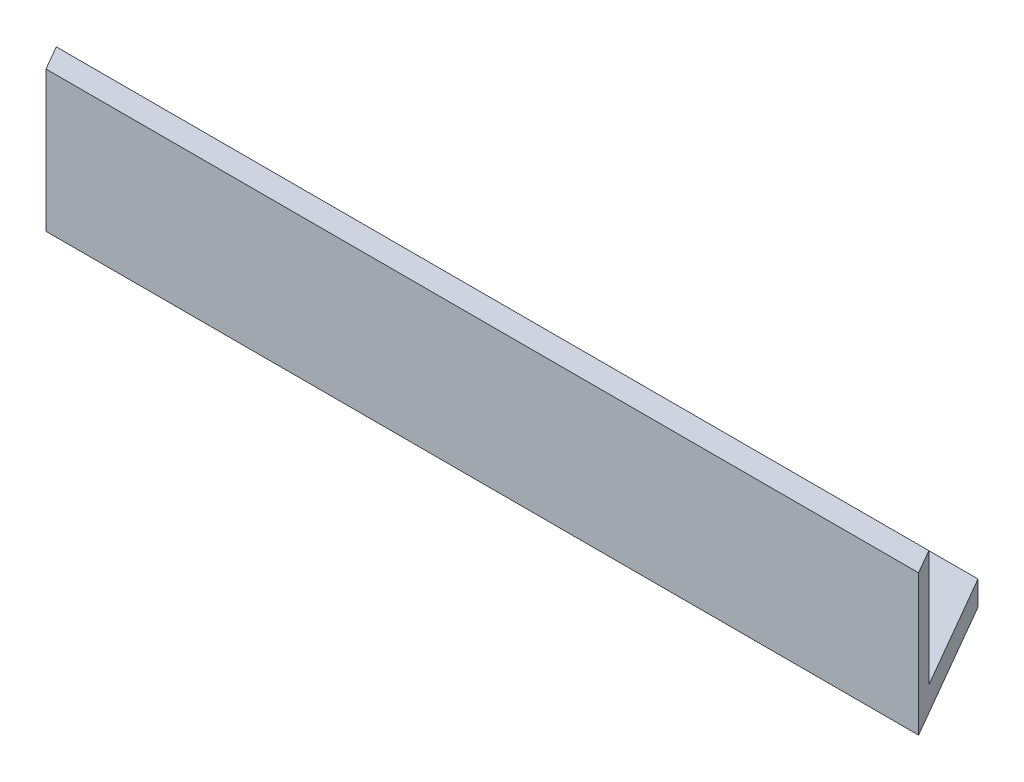
ISO-10303-21;
HEADER;
FILE_DESCRIPTION(('STEP AP214'),'2;1');
FILE_NAME('part.step','',(''),(''),'','','');
FILE_SCHEMA(('AUTOMOTIVE_DESIGN { 1 0 10303 214 1 1 1 1 }'));
ENDSEC;
DATA;
#1=APPLICATION_CONTEXT('core data for automotive mechanical design processes');
#2=APPLICATION_PROTOCOL_DEFINITION('international standard','automotive_design',2000,#1);
#3=PRODUCT_CONTEXT('',#1,'mechanical');
#4=PRODUCT('Part','Part','',(#3));
#5=PRODUCT_RELATED_PRODUCT_CATEGORY('part','',(#4));
#6=PRODUCT_DEFINITION_FORMATION('','',#4);
#7=PRODUCT_DEFINITION_CONTEXT('part definition',#1,'design');
#8=PRODUCT_DEFINITION('design','',#6,#7);
#9=PRODUCT_DEFINITION_SHAPE('','',#8);
#10=(LENGTH_UNIT() NAMED_UNIT(*) SI_UNIT(.MILLI.,.METRE.));
#11=(NAMED_UNIT(*) PLANE_ANGLE_UNIT() SI_UNIT($,.RADIAN.));
#12=(NAMED_UNIT(*) SI_UNIT($,.STERADIAN.) SOLID_ANGLE_UNIT());
#13=UNCERTAINTY_MEASURE_WITH_UNIT(LENGTH_MEASURE(1.E-05),#10,'distance_accuracy_value','');
#14=(GEOMETRIC_REPRESENTATION_CONTEXT(3) GLOBAL_UNCERTAINTY_ASSIGNED_CONTEXT((#13)) GLOBAL_UNIT_ASSIGNED_CONTEXT((#10,
#11,#12)) REPRESENTATION_CONTEXT('',''));
#15=CARTESIAN_POINT('',(0.,0.,0.));
#16=DIRECTION('',(0.,0.,1.));
#17=DIRECTION('',(1.,0.,0.));
#18=AXIS2_PLACEMENT_3D('',#15,#16,#17);
#19=CARTESIAN_POINT('',(240.,20.,0.));
#20=DIRECTION('',(0.,0.,-1.));
#21=DIRECTION('',(0.,1.,0.));
#22=AXIS2_PLACEMENT_3D('',#19,#20,#21);
#23=PLANE('',#22);
#24=DIRECTION('',(-1.,0.,0.));
#25=VECTOR('',#24,1.);
#26=CARTESIAN_POINT('',(240.,20.,0.));
#27=LINE('',#26,#25);
#28=CARTESIAN_POINT('',(135.677313259562,20.,0.));
#29=VERTEX_POINT('',#28);
#30=CARTESIAN_POINT('',(11.5470053837926,20.,0.));
#31=VERTEX_POINT('',#30);
#32=EDGE_CURVE('E102',#29,#31,#27,.T.);
#33=ORIENTED_EDGE('',*,*,#32,.T.);
#34=DIRECTION('',(0.,-1.,0.));
#35=VECTOR('',#34,1.);
#36=CARTESIAN_POINT('',(11.5470053837926,20.,0.));
#37=LINE('',#36,#35);
#38=CARTESIAN_POINT('',(11.5470053837926,0.,0.));
#39=VERTEX_POINT('',#38);
#40=EDGE_CURVE('E86',#31,#39,#37,.T.);
#41=ORIENTED_EDGE('',*,*,#40,.T.);
#42=DIRECTION('',(-1.,0.,0.));
#43=VECTOR('',#42,1.);
#44=CARTESIAN_POINT('',(240.,0.,0.));
#45=LINE('',#44,#43);
#46=CARTESIAN_POINT('',(135.677313259562,0.,0.));
#47=VERTEX_POINT('',#46);
#48=EDGE_CURVE('E11',#47,#39,#45,.T.);
#49=ORIENTED_EDGE('',*,*,#48,.F.);
#50=DIRECTION('',(0.,-1.,0.));
#51=VECTOR('',#50,1.);
#52=CARTESIAN_POINT('',(135.677313259562,20.,0.));
#53=LINE('',#52,#51);
#54=EDGE_CURVE('E107',#29,#47,#53,.T.);
#55=ORIENTED_EDGE('',*,*,#54,.F.);
#56=EDGE_LOOP('',(#33,#41,#49,#55));
#57=FACE_BOUND('',#56,.T.);
#58=ADVANCED_FACE('F36',(#57),#23,.F.);
#59=CARTESIAN_POINT('',(240.,0.,0.));
#60=DIRECTION('',(0.,1.,0.));
#61=DIRECTION('',(0.,0.,1.));
#62=AXIS2_PLACEMENT_3D('',#59,#60,#61);
#63=PLANE('',#62);
#64=ORIENTED_EDGE('',*,*,#48,.T.);
#65=DIRECTION('',(0.500000000000001,0.,0.866025403784438));
#66=VECTOR('',#65,1.);
#67=CARTESIAN_POINT('',(0.,0.,-20.));
#68=LINE('',#67,#66);
#69=CARTESIAN_POINT('',(0.,0.,-20.));
#70=VERTEX_POINT('',#69);
#71=EDGE_CURVE('E92',#70,#39,#68,.T.);
#72=ORIENTED_EDGE('',*,*,#71,.F.);
#73=DIRECTION('',(-1.,0.,0.));
#74=VECTOR('',#73,1.);
#75=CARTESIAN_POINT('',(240.,0.,-20.));
#76=LINE('',#75,#74);
#77=CARTESIAN_POINT('',(124.13030787577,0.,-20.));
#78=VERTEX_POINT('',#77);
#79=EDGE_CURVE('E43',#78,#70,#76,.T.);
#80=ORIENTED_EDGE('',*,*,#79,.F.);
#81=DIRECTION('',(-0.500000000000002,0.,-0.866025403784438));
#82=VECTOR('',#81,1.);
#83=CARTESIAN_POINT('',(135.677313259562,0.,0.));
#84=LINE('',#83,#82);
#85=EDGE_CURVE('E130',#47,#78,#84,.T.);
#86=ORIENTED_EDGE('',*,*,#85,.F.);
#87=EDGE_LOOP('',(#64,#72,#80,#86));
#88=FACE_BOUND('',#87,.T.);
#89=ADVANCED_FACE('F129',(#88),#63,.F.);
#90=CARTESIAN_POINT('',(240.,0.,-20.));
#91=DIRECTION('',(0.,0.,1.));
#92=DIRECTION('',(1.,0.,0.));
#93=AXIS2_PLACEMENT_3D('',#90,#91,#92);
#94=PLANE('',#93);
#95=DIRECTION('',(-1.,0.,0.));
#96=VECTOR('',#95,1.);
#97=CARTESIAN_POINT('',(240.,3.46117846701572,-20.));
#98=LINE('',#97,#96);
#99=CARTESIAN_POINT('',(124.13030787577,3.46117846701572,-20.));
#100=VERTEX_POINT('',#99);
#101=CARTESIAN_POINT('',(0.,3.46117846701572,-20.));
#102=VERTEX_POINT('',#101);
#103=EDGE_CURVE('E119',#100,#102,#98,.T.);
#104=ORIENTED_EDGE('',*,*,#103,.F.);
#105=DIRECTION('',(0.,-1.,0.));
#106=VECTOR('',#105,1.);
#107=CARTESIAN_POINT('',(124.13030787577,20.,-20.));
#108=LINE('',#107,#106);
#109=EDGE_CURVE('E126',#100,#78,#108,.T.);
#110=ORIENTED_EDGE('',*,*,#109,.T.);
#111=ORIENTED_EDGE('',*,*,#79,.T.);
#112=DIRECTION('',(0.,1.,0.));
#113=VECTOR('',#112,1.);
#114=CARTESIAN_POINT('',(0.,0.,-20.));
#115=LINE('',#114,#113);
#116=EDGE_CURVE('E108',#70,#102,#115,.T.);
#117=ORIENTED_EDGE('',*,*,#116,.T.);
#118=EDGE_LOOP('',(#104,#110,#111,#117));
#119=FACE_BOUND('',#118,.T.);
#120=ADVANCED_FACE('F125',(#119),#94,.F.);
#121=CARTESIAN_POINT('',(240.,3.46117846701572,-20.));
#122=DIRECTION('',(0.,-1.,0.));
#123=DIRECTION('',(0.,0.,-1.));
#124=AXIS2_PLACEMENT_3D('',#121,#122,#123);
#125=PLANE('',#124);
#126=ORIENTED_EDGE('',*,*,#103,.T.);
#127=DIRECTION('',(0.500000000000001,0.,0.866025403784438));
#128=VECTOR('',#127,1.);
#129=CARTESIAN_POINT('',(60.0000000000003,3.46117846701571,83.9230484541328));
#130=LINE('',#129,#128);
#131=CARTESIAN_POINT('',(9.54869306414768,3.46117846701572,-3.46117846701572));
#132=VERTEX_POINT('',#131);
#133=EDGE_CURVE('E58',#102,#132,#130,.T.);
#134=ORIENTED_EDGE('',*,*,#133,.T.);
#135=DIRECTION('',(-1.,0.,0.));
#136=VECTOR('',#135,1.);
#137=CARTESIAN_POINT('',(240.,3.46117846701572,-3.46117846701572));
#138=LINE('',#137,#136);
#139=CARTESIAN_POINT('',(133.679000939917,3.46117846701572,-3.46117846701572));
#140=VERTEX_POINT('',#139);
#141=EDGE_CURVE('E110',#140,#132,#138,.T.);
#142=ORIENTED_EDGE('',*,*,#141,.F.);
#143=DIRECTION('',(-0.500000000000002,0.,-0.866025403784438));
#144=VECTOR('',#143,1.);
#145=CARTESIAN_POINT('',(153.097730906827,3.46117846701571,30.1730484541327));
#146=LINE('',#145,#144);
#147=EDGE_CURVE('E113',#140,#100,#146,.T.);
#148=ORIENTED_EDGE('',*,*,#147,.T.);
#149=EDGE_LOOP('',(#126,#134,#142,#148));
#150=FACE_BOUND('',#149,.T.);
#151=ADVANCED_FACE('F143',(#150),#125,.F.);
#152=CARTESIAN_POINT('',(240.,3.46117846701572,-3.46117846701572));
#153=DIRECTION('',(0.,0.,1.));
#154=DIRECTION('',(1.,0.,0.));
#155=AXIS2_PLACEMENT_3D('',#152,#153,#154);
#156=PLANE('',#155);
#157=ORIENTED_EDGE('',*,*,#141,.T.);
#158=DIRECTION('',(0.,1.,0.));
#159=VECTOR('',#158,1.);
#160=CARTESIAN_POINT('',(9.54869306414768,3.46117846701572,-3.46117846701572));
#161=LINE('',#160,#159);
#162=CARTESIAN_POINT('',(9.54869306414769,20.,-3.46117846701571));
#163=VERTEX_POINT('',#162);
#164=EDGE_CURVE('E96',#132,#163,#161,.T.);
#165=ORIENTED_EDGE('',*,*,#164,.T.);
#166=DIRECTION('',(-1.,0.,0.));
#167=VECTOR('',#166,1.);
#168=CARTESIAN_POINT('',(240.,20.,-3.46117846701572));
#169=LINE('',#168,#167);
#170=CARTESIAN_POINT('',(133.679000939917,20.,-3.46117846701572));
#171=VERTEX_POINT('',#170);
#172=EDGE_CURVE('E104',#171,#163,#169,.T.);
#173=ORIENTED_EDGE('',*,*,#172,.F.);
#174=DIRECTION('',(0.,-1.,0.));
#175=VECTOR('',#174,1.);
#176=CARTESIAN_POINT('',(133.679000939917,3.46117846701572,-3.46117846701572));
#177=LINE('',#176,#175);
#178=EDGE_CURVE('E50',#171,#140,#177,.T.);
#179=ORIENTED_EDGE('',*,*,#178,.T.);
#180=EDGE_LOOP('',(#157,#165,#173,#179));
#181=FACE_BOUND('',#180,.T.);
#182=ADVANCED_FACE('F146',(#181),#156,.F.);
#183=CARTESIAN_POINT('',(240.,20.,-3.46117846701572));
#184=DIRECTION('',(0.,-1.,0.));
#185=DIRECTION('',(0.,0.,-1.));
#186=AXIS2_PLACEMENT_3D('',#183,#184,#185);
#187=PLANE('',#186);
#188=ORIENTED_EDGE('',*,*,#172,.T.);
#189=DIRECTION('',(0.500000000000001,0.,0.866025403784438));
#190=VECTOR('',#189,1.);
#191=CARTESIAN_POINT('',(0.,20.,-20.));
#192=LINE('',#191,#190);
#193=EDGE_CURVE('E89',#163,#31,#192,.T.);
#194=ORIENTED_EDGE('',*,*,#193,.T.);
#195=ORIENTED_EDGE('',*,*,#32,.F.);
#196=DIRECTION('',(-0.500000000000002,0.,-0.866025403784438));
#197=VECTOR('',#196,1.);
#198=CARTESIAN_POINT('',(135.677313259562,20.,0.));
#199=LINE('',#198,#197);
#200=EDGE_CURVE('E132',#29,#171,#199,.T.);
#201=ORIENTED_EDGE('',*,*,#200,.T.);
#202=EDGE_LOOP('',(#188,#194,#195,#201));
#203=FACE_BOUND('',#202,.T.);
#204=ADVANCED_FACE('F101',(#203),#187,.F.);
#205=CARTESIAN_POINT('',(0.,20.,-20.));
#206=DIRECTION('',(0.866025403784438,0.,-0.500000000000001));
#207=DIRECTION('',(-0.500000000000001,0.,-0.866025403784438));
#208=AXIS2_PLACEMENT_3D('',#205,#206,#207);
#209=PLANE('',#208);
#210=ORIENTED_EDGE('',*,*,#116,.F.);
#211=ORIENTED_EDGE('',*,*,#71,.T.);
#212=ORIENTED_EDGE('',*,*,#40,.F.);
#213=ORIENTED_EDGE('',*,*,#193,.F.);
#214=ORIENTED_EDGE('',*,*,#164,.F.);
#215=ORIENTED_EDGE('',*,*,#133,.F.);
#216=EDGE_LOOP('',(#210,#211,#212,#213,#214,#215));
#217=FACE_BOUND('',#216,.T.);
#218=ADVANCED_FACE('F88',(#217),#209,.F.);
#219=CARTESIAN_POINT('',(135.677313259562,20.,0.));
#220=DIRECTION('',(-0.866025403784438,0.,0.500000000000002));
#221=DIRECTION('',(0.500000000000002,0.,0.866025403784438));
#222=AXIS2_PLACEMENT_3D('',#219,#220,#221);
#223=PLANE('',#222);
#224=ORIENTED_EDGE('',*,*,#178,.F.);
#225=ORIENTED_EDGE('',*,*,#200,.F.);
#226=ORIENTED_EDGE('',*,*,#54,.T.);
#227=ORIENTED_EDGE('',*,*,#85,.T.);
#228=ORIENTED_EDGE('',*,*,#109,.F.);
#229=ORIENTED_EDGE('',*,*,#147,.F.);
#230=EDGE_LOOP('',(#224,#225,#226,#227,#228,#229));
#231=FACE_BOUND('',#230,.T.);
#232=ADVANCED_FACE('F144',(#231),#223,.F.);
#233=CLOSED_SHELL('',(#58,#89,#120,#151,#182,#204,#218,#232));
#234=MANIFOLD_SOLID_BREP('B2',#233);
#235=ADVANCED_BREP_SHAPE_REPRESENTATION('',(#18,#234),#14);
#236=SHAPE_DEFINITION_REPRESENTATION(#9,#235);
ENDSEC;
END-ISO-10303-21;
